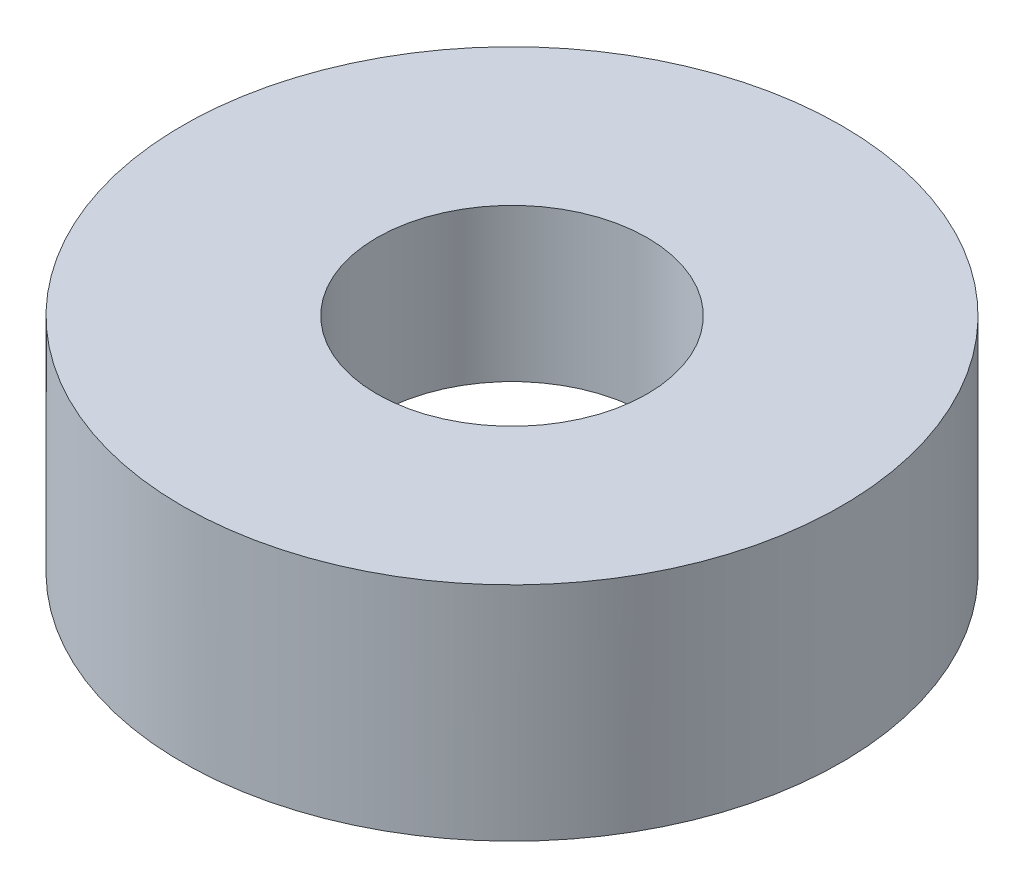
ISO-10303-21;
HEADER;
FILE_DESCRIPTION(('STEP AP214'),'2;1');
FILE_NAME('part.step','',(''),(''),'','','');
FILE_SCHEMA(('AUTOMOTIVE_DESIGN { 1 0 10303 214 1 1 1 1 }'));
ENDSEC;
DATA;
#1=APPLICATION_CONTEXT('core data for automotive mechanical design processes');
#2=APPLICATION_PROTOCOL_DEFINITION('international standard','automotive_design',2000,#1);
#3=PRODUCT_CONTEXT('',#1,'mechanical');
#4=PRODUCT('Part','Part','',(#3));
#5=PRODUCT_RELATED_PRODUCT_CATEGORY('part','',(#4));
#6=PRODUCT_DEFINITION_FORMATION('','',#4);
#7=PRODUCT_DEFINITION_CONTEXT('part definition',#1,'design');
#8=PRODUCT_DEFINITION('design','',#6,#7);
#9=PRODUCT_DEFINITION_SHAPE('','',#8);
#10=(LENGTH_UNIT() NAMED_UNIT(*) SI_UNIT(.MILLI.,.METRE.));
#11=(NAMED_UNIT(*) PLANE_ANGLE_UNIT() SI_UNIT($,.RADIAN.));
#12=(NAMED_UNIT(*) SI_UNIT($,.STERADIAN.) SOLID_ANGLE_UNIT());
#13=UNCERTAINTY_MEASURE_WITH_UNIT(LENGTH_MEASURE(1.E-05),#10,'distance_accuracy_value','');
#14=(GEOMETRIC_REPRESENTATION_CONTEXT(3) GLOBAL_UNCERTAINTY_ASSIGNED_CONTEXT((#13)) GLOBAL_UNIT_ASSIGNED_CONTEXT((#10,
#11,#12)) REPRESENTATION_CONTEXT('',''));
#15=CARTESIAN_POINT('',(0.,0.,0.));
#16=DIRECTION('',(0.,0.,1.));
#17=DIRECTION('',(1.,0.,0.));
#18=AXIS2_PLACEMENT_3D('',#15,#16,#17);
#19=CARTESIAN_POINT('',(0.,0.,0.));
#20=DIRECTION('',(0.,1.,0.));
#21=DIRECTION('',(0.,0.,1.));
#22=AXIS2_PLACEMENT_3D('',#19,#20,#21);
#23=PLANE('',#22);
#24=CARTESIAN_POINT('',(0.,0.,0.));
#25=DIRECTION('',(0.,1.,0.));
#26=DIRECTION('',(0.,0.,1.));
#27=AXIS2_PLACEMENT_3D('',#24,#25,#26);
#28=CIRCLE('',#27,1.95);
#29=CARTESIAN_POINT('',(0.,0.,1.95));
#30=VERTEX_POINT('',#29);
#31=EDGE_CURVE('E52',#30,#30,#28,.T.);
#32=ORIENTED_EDGE('',*,*,#31,.T.);
#33=EDGE_LOOP('',(#32));
#34=FACE_BOUND('',#33,.T.);
#35=CARTESIAN_POINT('',(0.,0.,0.));
#36=DIRECTION('',(0.,-1.,0.));
#37=DIRECTION('',(0.,0.,-1.));
#38=AXIS2_PLACEMENT_3D('',#35,#36,#37);
#39=CIRCLE('',#38,4.25);
#40=CARTESIAN_POINT('',(0.,0.,-4.25));
#41=VERTEX_POINT('',#40);
#42=EDGE_CURVE('E62',#41,#41,#39,.T.);
#43=ORIENTED_EDGE('',*,*,#42,.T.);
#44=EDGE_LOOP('',(#43));
#45=FACE_BOUND('',#44,.T.);
#46=ADVANCED_FACE('F41',(#34,#45),#23,.F.);
#47=CARTESIAN_POINT('',(0.,2.2,0.));
#48=DIRECTION('',(0.,1.,0.));
#49=DIRECTION('',(0.,0.,1.));
#50=AXIS2_PLACEMENT_3D('',#47,#48,#49);
#51=PLANE('',#50);
#52=CARTESIAN_POINT('',(0.,2.2,0.));
#53=DIRECTION('',(0.,1.,0.));
#54=DIRECTION('',(0.,0.,1.));
#55=AXIS2_PLACEMENT_3D('',#52,#53,#54);
#56=CIRCLE('',#55,4.75);
#57=CARTESIAN_POINT('',(0.,2.2,4.75));
#58=VERTEX_POINT('',#57);
#59=EDGE_CURVE('E10',#58,#58,#56,.T.);
#60=ORIENTED_EDGE('',*,*,#59,.T.);
#61=EDGE_LOOP('',(#60));
#62=FACE_BOUND('',#61,.T.);
#63=CARTESIAN_POINT('',(0.,2.2,0.));
#64=DIRECTION('',(0.,1.,0.));
#65=DIRECTION('',(0.,0.,1.));
#66=AXIS2_PLACEMENT_3D('',#63,#64,#65);
#67=CIRCLE('',#66,1.95);
#68=CARTESIAN_POINT('',(0.,2.2,1.95));
#69=VERTEX_POINT('',#68);
#70=EDGE_CURVE('E48',#69,#69,#67,.T.);
#71=ORIENTED_EDGE('',*,*,#70,.F.);
#72=EDGE_LOOP('',(#71));
#73=FACE_BOUND('',#72,.T.);
#74=ADVANCED_FACE('F84',(#62,#73),#51,.T.);
#75=CARTESIAN_POINT('',(0.,2.2,0.));
#76=DIRECTION('',(0.,-1.,0.));
#77=DIRECTION('',(0.,0.,-1.));
#78=AXIS2_PLACEMENT_3D('',#75,#76,#77);
#79=CYLINDRICAL_SURFACE('',#78,4.75);
#80=ORIENTED_EDGE('',*,*,#59,.F.);
#81=EDGE_LOOP('',(#80));
#82=FACE_BOUND('',#81,.T.);
#83=CARTESIAN_POINT('',(0.,-1.,0.));
#84=DIRECTION('',(0.,-1.,0.));
#85=DIRECTION('',(0.,0.,-1.));
#86=AXIS2_PLACEMENT_3D('',#83,#84,#85);
#87=CIRCLE('',#86,4.75);
#88=CARTESIAN_POINT('',(0.,-1.,-4.75));
#89=VERTEX_POINT('',#88);
#90=EDGE_CURVE('E57',#89,#89,#87,.T.);
#91=ORIENTED_EDGE('',*,*,#90,.F.);
#92=EDGE_LOOP('',(#91));
#93=FACE_BOUND('',#92,.T.);
#94=ADVANCED_FACE('F43',(#82,#93),#79,.T.);
#95=CARTESIAN_POINT('',(0.,2.2,0.));
#96=DIRECTION('',(0.,-1.,0.));
#97=DIRECTION('',(0.,0.,-1.));
#98=AXIS2_PLACEMENT_3D('',#95,#96,#97);
#99=CYLINDRICAL_SURFACE('',#98,1.95);
#100=ORIENTED_EDGE('',*,*,#70,.T.);
#101=EDGE_LOOP('',(#100));
#102=FACE_BOUND('',#101,.T.);
#103=ORIENTED_EDGE('',*,*,#31,.F.);
#104=EDGE_LOOP('',(#103));
#105=FACE_BOUND('',#104,.T.);
#106=ADVANCED_FACE('F73',(#102,#105),#99,.F.);
#107=CARTESIAN_POINT('',(0.,-1.,0.));
#108=DIRECTION('',(0.,-1.,0.));
#109=DIRECTION('',(0.,0.,-1.));
#110=AXIS2_PLACEMENT_3D('',#107,#108,#109);
#111=PLANE('',#110);
#112=ORIENTED_EDGE('',*,*,#90,.T.);
#113=EDGE_LOOP('',(#112));
#114=FACE_BOUND('',#113,.T.);
#115=CARTESIAN_POINT('',(0.,-1.,0.));
#116=DIRECTION('',(0.,-1.,0.));
#117=DIRECTION('',(0.,0.,-1.));
#118=AXIS2_PLACEMENT_3D('',#115,#116,#117);
#119=CIRCLE('',#118,4.25);
#120=CARTESIAN_POINT('',(0.,-1.,-4.25));
#121=VERTEX_POINT('',#120);
#122=EDGE_CURVE('E61',#121,#121,#119,.T.);
#123=ORIENTED_EDGE('',*,*,#122,.F.);
#124=EDGE_LOOP('',(#123));
#125=FACE_BOUND('',#124,.T.);
#126=ADVANCED_FACE('F71',(#114,#125),#111,.T.);
#127=CARTESIAN_POINT('',(0.,-1.,0.));
#128=DIRECTION('',(0.,1.,0.));
#129=DIRECTION('',(0.,0.,1.));
#130=AXIS2_PLACEMENT_3D('',#127,#128,#129);
#131=CYLINDRICAL_SURFACE('',#130,4.25);
#132=ORIENTED_EDGE('',*,*,#122,.T.);
#133=EDGE_LOOP('',(#132));
#134=FACE_BOUND('',#133,.T.);
#135=ORIENTED_EDGE('',*,*,#42,.F.);
#136=EDGE_LOOP('',(#135));
#137=FACE_BOUND('',#136,.T.);
#138=ADVANCED_FACE('F68',(#134,#137),#131,.F.);
#139=CLOSED_SHELL('',(#46,#74,#94,#106,#126,#138));
#140=MANIFOLD_SOLID_BREP('B2',#139);
#141=ADVANCED_BREP_SHAPE_REPRESENTATION('',(#18,#140),#14);
#142=SHAPE_DEFINITION_REPRESENTATION(#9,#141);
ENDSEC;
END-ISO-10303-21;
